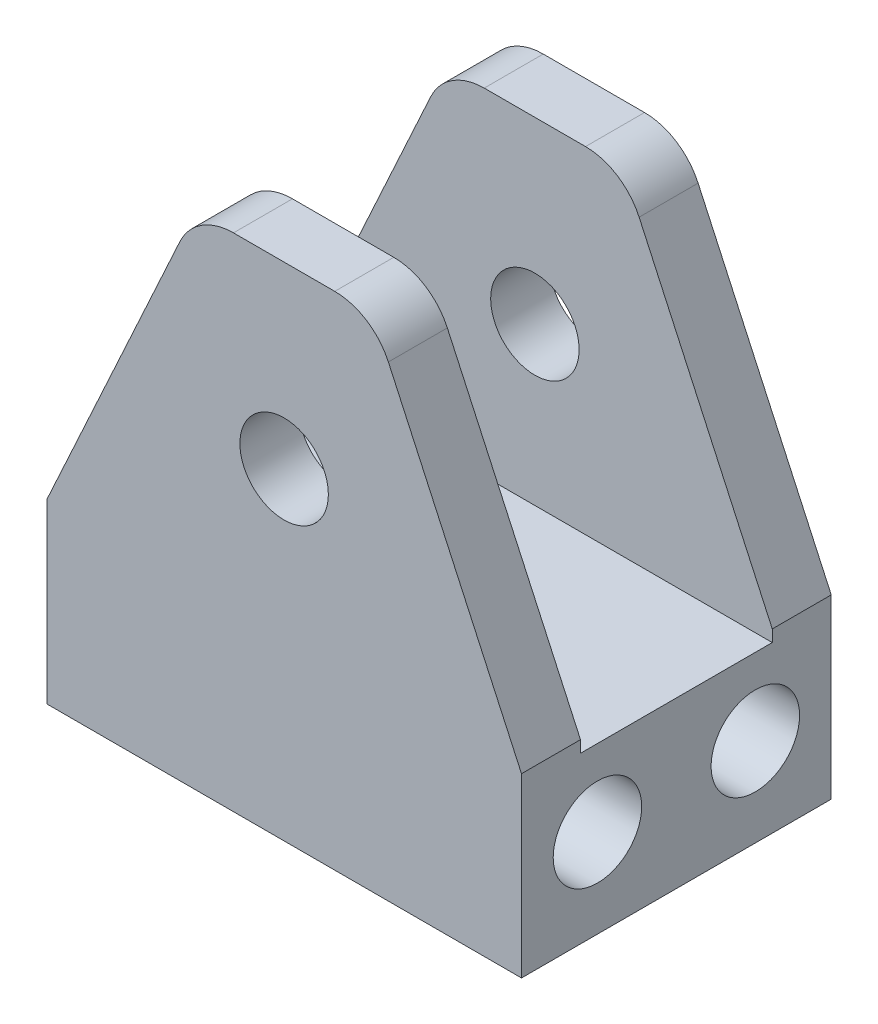
ISO-10303-21;
HEADER;
FILE_DESCRIPTION(('STEP AP214'),'2;1');
FILE_NAME('part.step','',(''),(''),'','','');
FILE_SCHEMA(('AUTOMOTIVE_DESIGN { 1 0 10303 214 1 1 1 1 }'));
ENDSEC;
DATA;
#1=APPLICATION_CONTEXT('core data for automotive mechanical design processes');
#2=APPLICATION_PROTOCOL_DEFINITION('international standard','automotive_design',2000,#1);
#3=PRODUCT_CONTEXT('',#1,'mechanical');
#4=PRODUCT('Part','Part','',(#3));
#5=PRODUCT_RELATED_PRODUCT_CATEGORY('part','',(#4));
#6=PRODUCT_DEFINITION_FORMATION('','',#4);
#7=PRODUCT_DEFINITION_CONTEXT('part definition',#1,'design');
#8=PRODUCT_DEFINITION('design','',#6,#7);
#9=PRODUCT_DEFINITION_SHAPE('','',#8);
#10=(LENGTH_UNIT() NAMED_UNIT(*) SI_UNIT(.MILLI.,.METRE.));
#11=(NAMED_UNIT(*) PLANE_ANGLE_UNIT() SI_UNIT($,.RADIAN.));
#12=(NAMED_UNIT(*) SI_UNIT($,.STERADIAN.) SOLID_ANGLE_UNIT());
#13=UNCERTAINTY_MEASURE_WITH_UNIT(LENGTH_MEASURE(1.E-05),#10,'distance_accuracy_value','');
#14=(GEOMETRIC_REPRESENTATION_CONTEXT(3) GLOBAL_UNCERTAINTY_ASSIGNED_CONTEXT((#13)) GLOBAL_UNIT_ASSIGNED_CONTEXT((#10,
#11,#12)) REPRESENTATION_CONTEXT('',''));
#15=CARTESIAN_POINT('',(0.,0.,0.));
#16=DIRECTION('',(0.,0.,1.));
#17=DIRECTION('',(1.,0.,0.));
#18=AXIS2_PLACEMENT_3D('',#15,#16,#17);
#19=CARTESIAN_POINT('',(0.,44.45,0.));
#20=DIRECTION('',(0.,-1.,0.));
#21=DIRECTION('',(0.,0.,-1.));
#22=AXIS2_PLACEMENT_3D('',#19,#20,#21);
#23=PLANE('',#22);
#24=DIRECTION('',(-1.,0.,0.));
#25=VECTOR('',#24,1.);
#26=CARTESIAN_POINT('',(-25.55875,44.45,-10.3251));
#27=LINE('',#26,#25);
#28=CARTESIAN_POINT('',(5.45302110347387,44.45,-10.3251));
#29=VERTEX_POINT('',#28);
#30=CARTESIAN_POINT('',(-5.45302110347386,44.45,-10.3251));
#31=VERTEX_POINT('',#30);
#32=EDGE_CURVE('E274',#29,#31,#27,.T.);
#33=ORIENTED_EDGE('',*,*,#32,.F.);
#34=DIRECTION('',(0.,0.,-1.));
#35=VECTOR('',#34,1.);
#36=CARTESIAN_POINT('',(5.45302110347387,44.45,0.));
#37=LINE('',#36,#35);
#38=CARTESIAN_POINT('',(5.45302110347386,44.45,-16.6751));
#39=VERTEX_POINT('',#38);
#40=EDGE_CURVE('E227',#29,#39,#37,.T.);
#41=ORIENTED_EDGE('',*,*,#40,.T.);
#42=DIRECTION('',(-1.,0.,0.));
#43=VECTOR('',#42,1.);
#44=CARTESIAN_POINT('',(-25.55875,44.45,-16.6751));
#45=LINE('',#44,#43);
#46=CARTESIAN_POINT('',(-5.45302110347387,44.45,-16.6751));
#47=VERTEX_POINT('',#46);
#48=EDGE_CURVE('E304',#39,#47,#45,.T.);
#49=ORIENTED_EDGE('',*,*,#48,.T.);
#50=DIRECTION('',(0.,0.,-1.));
#51=VECTOR('',#50,1.);
#52=CARTESIAN_POINT('',(-5.45302110347387,44.45,-10.3251));
#53=LINE('',#52,#51);
#54=EDGE_CURVE('E225',#47,#31,#53,.F.);
#55=ORIENTED_EDGE('',*,*,#54,.T.);
#56=EDGE_LOOP('',(#33,#41,#49,#55));
#57=FACE_BOUND('',#56,.T.);
#58=ADVANCED_FACE('F41',(#57),#23,.F.);
#59=CARTESIAN_POINT('',(-25.55875,-9.525,16.6751));
#60=DIRECTION('',(0.,0.,1.));
#61=DIRECTION('',(1.,0.,0.));
#62=AXIS2_PLACEMENT_3D('',#59,#60,#61);
#63=PLANE('',#62);
#64=CARTESIAN_POINT('',(-2.32470293015652E-11,25.1616625766068,16.6751));
#65=DIRECTION('',(0.,0.,1.));
#66=DIRECTION('',(1.,0.,0.));
#67=AXIS2_PLACEMENT_3D('',#64,#65,#66);
#68=CIRCLE('',#67,4.76249999999999);
#69=CARTESIAN_POINT('',(4.76249999997674,25.1616625766068,16.6751));
#70=VERTEX_POINT('',#69);
#71=EDGE_CURVE('E239',#70,#70,#68,.T.);
#72=ORIENTED_EDGE('',*,*,#71,.F.);
#73=EDGE_LOOP('',(#72));
#74=FACE_BOUND('',#73,.T.);
#75=DIRECTION('',(-0.417223594396781,0.908803868983088,0.));
#76=VECTOR('',#75,1.);
#77=CARTESIAN_POINT('',(24.7212334260508,11.3492935274142,16.6751));
#78=LINE('',#77,#76);
#79=CARTESIAN_POINT('',(25.55875,9.52499999999999,16.6751));
#80=VERTEX_POINT('',#79);
#81=CARTESIAN_POINT('',(11.2239256715165,40.7493698244196,16.6751));
#82=VERTEX_POINT('',#81);
#83=EDGE_CURVE('E256',#80,#82,#78,.T.);
#84=ORIENTED_EDGE('',*,*,#83,.T.);
#85=CARTESIAN_POINT('',(5.45302110347387,38.1,16.6751));
#86=DIRECTION('',(0.,0.,1.));
#87=DIRECTION('',(1.,0.,0.));
#88=AXIS2_PLACEMENT_3D('',#85,#86,#87);
#89=CIRCLE('',#88,6.35);
#90=CARTESIAN_POINT('',(5.45302110347386,44.45,16.6751));
#91=VERTEX_POINT('',#90);
#92=EDGE_CURVE('E221',#82,#91,#89,.T.);
#93=ORIENTED_EDGE('',*,*,#92,.T.);
#94=DIRECTION('',(1.,0.,0.));
#95=VECTOR('',#94,1.);
#96=CARTESIAN_POINT('',(-25.55875,44.45,16.6751));
#97=LINE('',#96,#95);
#98=CARTESIAN_POINT('',(-5.45302110347387,44.45,16.6751));
#99=VERTEX_POINT('',#98);
#100=EDGE_CURVE('E307',#99,#91,#97,.T.);
#101=ORIENTED_EDGE('',*,*,#100,.F.);
#102=CARTESIAN_POINT('',(-5.45302110347387,38.1,16.6751));
#103=DIRECTION('',(0.,0.,1.));
#104=DIRECTION('',(1.,0.,0.));
#105=AXIS2_PLACEMENT_3D('',#102,#103,#104);
#106=CIRCLE('',#105,6.35);
#107=CARTESIAN_POINT('',(-11.2239256715165,40.7493698244196,16.6751));
#108=VERTEX_POINT('',#107);
#109=EDGE_CURVE('E182',#99,#108,#106,.T.);
#110=ORIENTED_EDGE('',*,*,#109,.T.);
#111=DIRECTION('',(0.417223594396782,0.908803868983088,0.));
#112=VECTOR('',#111,1.);
#113=CARTESIAN_POINT('',(-24.7212334260508,11.3492935274142,16.6751));
#114=LINE('',#113,#112);
#115=CARTESIAN_POINT('',(-25.55875,9.525,16.6751));
#116=VERTEX_POINT('',#115);
#117=EDGE_CURVE('E163',#116,#108,#114,.T.);
#118=ORIENTED_EDGE('',*,*,#117,.F.);
#119=DIRECTION('',(0.,1.,0.));
#120=VECTOR('',#119,1.);
#121=CARTESIAN_POINT('',(-25.55875,-9.525,16.6751));
#122=LINE('',#121,#120);
#123=CARTESIAN_POINT('',(-25.55875,-9.525,16.6751));
#124=VERTEX_POINT('',#123);
#125=EDGE_CURVE('E178',#124,#116,#122,.T.);
#126=ORIENTED_EDGE('',*,*,#125,.F.);
#127=DIRECTION('',(1.,0.,0.));
#128=VECTOR('',#127,1.);
#129=CARTESIAN_POINT('',(-25.55875,-9.525,16.6751));
#130=LINE('',#129,#128);
#131=CARTESIAN_POINT('',(25.55875,-9.525,16.6751));
#132=VERTEX_POINT('',#131);
#133=EDGE_CURVE('E208',#124,#132,#130,.T.);
#134=ORIENTED_EDGE('',*,*,#133,.T.);
#135=DIRECTION('',(0.,1.,0.));
#136=VECTOR('',#135,1.);
#137=CARTESIAN_POINT('',(25.55875,-9.525,16.6751));
#138=LINE('',#137,#136);
#139=EDGE_CURVE('E189',#132,#80,#138,.T.);
#140=ORIENTED_EDGE('',*,*,#139,.T.);
#141=EDGE_LOOP('',(#84,#93,#101,#110,#118,#126,#134,#140));
#142=FACE_BOUND('',#141,.T.);
#143=ADVANCED_FACE('F176',(#74,#142),#63,.T.);
#144=CARTESIAN_POINT('',(-25.55875,-9.525,16.6751));
#145=DIRECTION('',(-1.,0.,0.));
#146=DIRECTION('',(0.,0.,1.));
#147=AXIS2_PLACEMENT_3D('',#144,#145,#146);
#148=PLANE('',#147);
#149=CARTESIAN_POINT('',(-25.55875,0.,-8.5));
#150=DIRECTION('',(-1.,0.,0.));
#151=DIRECTION('',(0.,0.,1.));
#152=AXIS2_PLACEMENT_3D('',#149,#150,#151);
#153=CIRCLE('',#152,4.76249999999999);
#154=CARTESIAN_POINT('',(-25.55875,0.,-3.73750000000001));
#155=VERTEX_POINT('',#154);
#156=EDGE_CURVE('E422',#155,#155,#153,.T.);
#157=ORIENTED_EDGE('',*,*,#156,.F.);
#158=EDGE_LOOP('',(#157));
#159=FACE_BOUND('',#158,.T.);
#160=CARTESIAN_POINT('',(-25.55875,0.,8.5));
#161=DIRECTION('',(-1.,0.,0.));
#162=DIRECTION('',(0.,0.,1.));
#163=AXIS2_PLACEMENT_3D('',#160,#161,#162);
#164=CIRCLE('',#163,4.76249999999999);
#165=CARTESIAN_POINT('',(-25.55875,0.,13.2625));
#166=VERTEX_POINT('',#165);
#167=EDGE_CURVE('E251',#166,#166,#164,.T.);
#168=ORIENTED_EDGE('',*,*,#167,.F.);
#169=EDGE_LOOP('',(#168));
#170=FACE_BOUND('',#169,.T.);
#171=ORIENTED_EDGE('',*,*,#125,.T.);
#172=DIRECTION('',(0.,0.,-1.));
#173=VECTOR('',#172,1.);
#174=CARTESIAN_POINT('',(-25.55875,9.525,16.6751));
#175=LINE('',#174,#173);
#176=CARTESIAN_POINT('',(-25.55875,9.525,10.3251));
#177=VERTEX_POINT('',#176);
#178=EDGE_CURVE('E159',#116,#177,#175,.T.);
#179=ORIENTED_EDGE('',*,*,#178,.T.);
#180=DIRECTION('',(0.,1.,0.));
#181=VECTOR('',#180,1.);
#182=CARTESIAN_POINT('',(-25.55875,-64.6560218143106,10.3251));
#183=LINE('',#182,#181);
#184=CARTESIAN_POINT('',(-25.55875,8.255,10.3251));
#185=VERTEX_POINT('',#184);
#186=EDGE_CURVE('E293',#185,#177,#183,.T.);
#187=ORIENTED_EDGE('',*,*,#186,.F.);
#188=DIRECTION('',(0.,0.,1.));
#189=VECTOR('',#188,1.);
#190=CARTESIAN_POINT('',(-25.55875,8.255,10.3251));
#191=LINE('',#190,#189);
#192=CARTESIAN_POINT('',(-25.55875,8.255,-10.3251));
#193=VERTEX_POINT('',#192);
#194=EDGE_CURVE('E294',#193,#185,#191,.T.);
#195=ORIENTED_EDGE('',*,*,#194,.F.);
#196=DIRECTION('',(0.,1.,0.));
#197=VECTOR('',#196,1.);
#198=CARTESIAN_POINT('',(-25.55875,-64.6560218143106,-10.3251));
#199=LINE('',#198,#197);
#200=CARTESIAN_POINT('',(-25.55875,9.52500000000001,-10.3251));
#201=VERTEX_POINT('',#200);
#202=EDGE_CURVE('E284',#193,#201,#199,.T.);
#203=ORIENTED_EDGE('',*,*,#202,.T.);
#204=CARTESIAN_POINT('',(-25.55875,9.525,-16.6751));
#205=VERTEX_POINT('',#204);
#206=EDGE_CURVE('E172',#201,#205,#175,.T.);
#207=ORIENTED_EDGE('',*,*,#206,.T.);
#208=DIRECTION('',(0.,1.,0.));
#209=VECTOR('',#208,1.);
#210=CARTESIAN_POINT('',(-25.55875,-9.525,-16.6751));
#211=LINE('',#210,#209);
#212=CARTESIAN_POINT('',(-25.55875,-9.525,-16.6751));
#213=VERTEX_POINT('',#212);
#214=EDGE_CURVE('E190',#213,#205,#211,.T.);
#215=ORIENTED_EDGE('',*,*,#214,.F.);
#216=DIRECTION('',(0.,0.,1.));
#217=VECTOR('',#216,1.);
#218=CARTESIAN_POINT('',(-25.55875,-9.525,16.6751));
#219=LINE('',#218,#217);
#220=EDGE_CURVE('E187',#213,#124,#219,.T.);
#221=ORIENTED_EDGE('',*,*,#220,.T.);
#222=EDGE_LOOP('',(#171,#179,#187,#195,#203,#207,#215,#221));
#223=FACE_BOUND('',#222,.T.);
#224=ADVANCED_FACE('F185',(#159,#170,#223),#148,.T.);
#225=CARTESIAN_POINT('',(-25.55875,-9.525,-16.6751));
#226=DIRECTION('',(0.,0.,-1.));
#227=DIRECTION('',(-1.,0.,0.));
#228=AXIS2_PLACEMENT_3D('',#225,#226,#227);
#229=PLANE('',#228);
#230=CARTESIAN_POINT('',(-2.32470293015652E-11,25.1616625766068,-16.6751));
#231=DIRECTION('',(0.,0.,-1.));
#232=DIRECTION('',(-1.,0.,0.));
#233=AXIS2_PLACEMENT_3D('',#230,#231,#232);
#234=CIRCLE('',#233,4.76249999999999);
#235=CARTESIAN_POINT('',(-4.76250000002324,25.1616625766068,-16.6751));
#236=VERTEX_POINT('',#235);
#237=EDGE_CURVE('E236',#236,#236,#234,.T.);
#238=ORIENTED_EDGE('',*,*,#237,.F.);
#239=EDGE_LOOP('',(#238));
#240=FACE_BOUND('',#239,.T.);
#241=ORIENTED_EDGE('',*,*,#48,.F.);
#242=CARTESIAN_POINT('',(5.45302110347387,38.1,-16.6751));
#243=DIRECTION('',(0.,0.,-1.));
#244=DIRECTION('',(-1.,0.,0.));
#245=AXIS2_PLACEMENT_3D('',#242,#243,#244);
#246=CIRCLE('',#245,6.35);
#247=CARTESIAN_POINT('',(11.2239256715165,40.7493698244196,-16.6751));
#248=VERTEX_POINT('',#247);
#249=EDGE_CURVE('E232',#39,#248,#246,.T.);
#250=ORIENTED_EDGE('',*,*,#249,.T.);
#251=DIRECTION('',(-0.417223594396782,0.908803868983088,0.));
#252=VECTOR('',#251,1.);
#253=CARTESIAN_POINT('',(23.8837168521015,13.1735870548284,-16.6751));
#254=LINE('',#253,#252);
#255=CARTESIAN_POINT('',(25.55875,9.52499999999999,-16.6751));
#256=VERTEX_POINT('',#255);
#257=EDGE_CURVE('E271',#256,#248,#254,.T.);
#258=ORIENTED_EDGE('',*,*,#257,.F.);
#259=DIRECTION('',(0.,1.,0.));
#260=VECTOR('',#259,1.);
#261=CARTESIAN_POINT('',(25.55875,-9.525,-16.6751));
#262=LINE('',#261,#260);
#263=CARTESIAN_POINT('',(25.55875,-9.525,-16.6751));
#264=VERTEX_POINT('',#263);
#265=EDGE_CURVE('E196',#264,#256,#262,.T.);
#266=ORIENTED_EDGE('',*,*,#265,.F.);
#267=DIRECTION('',(-1.,0.,0.));
#268=VECTOR('',#267,1.);
#269=CARTESIAN_POINT('',(-25.55875,-9.525,-16.6751));
#270=LINE('',#269,#268);
#271=EDGE_CURVE('E313',#264,#213,#270,.T.);
#272=ORIENTED_EDGE('',*,*,#271,.T.);
#273=ORIENTED_EDGE('',*,*,#214,.T.);
#274=DIRECTION('',(0.417223594396782,0.908803868983088,0.));
#275=VECTOR('',#274,1.);
#276=CARTESIAN_POINT('',(-32.7820226403986,-6.2088611969079,-16.6751));
#277=LINE('',#276,#275);
#278=CARTESIAN_POINT('',(-11.2239256715165,40.7493698244196,-16.6751));
#279=VERTEX_POINT('',#278);
#280=EDGE_CURVE('E270',#205,#279,#277,.T.);
#281=ORIENTED_EDGE('',*,*,#280,.T.);
#282=CARTESIAN_POINT('',(-5.45302110347387,38.1,-16.6751));
#283=DIRECTION('',(0.,0.,-1.));
#284=DIRECTION('',(-1.,0.,0.));
#285=AXIS2_PLACEMENT_3D('',#282,#283,#284);
#286=CIRCLE('',#285,6.35);
#287=EDGE_CURVE('E230',#279,#47,#286,.T.);
#288=ORIENTED_EDGE('',*,*,#287,.T.);
#289=EDGE_LOOP('',(#241,#250,#258,#266,#272,#273,#281,#288));
#290=FACE_BOUND('',#289,.T.);
#291=ADVANCED_FACE('F350',(#240,#290),#229,.T.);
#292=ORIENTED_EDGE('',*,*,#100,.T.);
#293=DIRECTION('',(0.,0.,-1.));
#294=VECTOR('',#293,1.);
#295=CARTESIAN_POINT('',(5.45302110347387,44.45,0.));
#296=LINE('',#295,#294);
#297=CARTESIAN_POINT('',(5.45302110347387,44.45,10.3251));
#298=VERTEX_POINT('',#297);
#299=EDGE_CURVE('E211',#91,#298,#296,.T.);
#300=ORIENTED_EDGE('',*,*,#299,.T.);
#301=DIRECTION('',(1.,0.,0.));
#302=VECTOR('',#301,1.);
#303=CARTESIAN_POINT('',(-25.55875,44.45,10.3251));
#304=LINE('',#303,#302);
#305=CARTESIAN_POINT('',(-5.45302110347386,44.45,10.3251));
#306=VERTEX_POINT('',#305);
#307=EDGE_CURVE('E277',#306,#298,#304,.T.);
#308=ORIENTED_EDGE('',*,*,#307,.F.);
#309=DIRECTION('',(0.,0.,-1.));
#310=VECTOR('',#309,1.);
#311=CARTESIAN_POINT('',(-5.45302110347387,44.45,16.6751));
#312=LINE('',#311,#310);
#313=EDGE_CURVE('E209',#306,#99,#312,.F.);
#314=ORIENTED_EDGE('',*,*,#313,.T.);
#315=EDGE_LOOP('',(#292,#300,#308,#314));
#316=FACE_BOUND('',#315,.T.);
#317=ADVANCED_FACE('F364',(#316),#23,.F.);
#318=CARTESIAN_POINT('',(-25.55875,-64.6560218143106,-10.3251));
#319=DIRECTION('',(0.,0.,-1.));
#320=DIRECTION('',(-1.,0.,0.));
#321=AXIS2_PLACEMENT_3D('',#318,#319,#320);
#322=PLANE('',#321);
#323=CARTESIAN_POINT('',(-2.32470293015652E-11,25.1616625766068,-10.3251));
#324=DIRECTION('',(0.,0.,-1.));
#325=DIRECTION('',(-1.,0.,0.));
#326=AXIS2_PLACEMENT_3D('',#323,#324,#325);
#327=CIRCLE('',#326,4.76249999999999);
#328=CARTESIAN_POINT('',(-4.76250000002324,25.1616625766068,-10.3251));
#329=VERTEX_POINT('',#328);
#330=EDGE_CURVE('E238',#329,#329,#327,.T.);
#331=ORIENTED_EDGE('',*,*,#330,.T.);
#332=EDGE_LOOP('',(#331));
#333=FACE_BOUND('',#332,.T.);
#334=DIRECTION('',(-0.417223594396782,0.908803868983088,0.));
#335=VECTOR('',#334,1.);
#336=CARTESIAN_POINT('',(44.7879898971687,-32.3604730433377,-10.3251));
#337=LINE('',#336,#335);
#338=CARTESIAN_POINT('',(25.55875,9.525,-10.3251));
#339=VERTEX_POINT('',#338);
#340=CARTESIAN_POINT('',(11.2239256715165,40.7493698244196,-10.3251));
#341=VERTEX_POINT('',#340);
#342=EDGE_CURVE('E171',#339,#341,#337,.T.);
#343=ORIENTED_EDGE('',*,*,#342,.T.);
#344=CARTESIAN_POINT('',(5.45302110347387,38.1,-10.3251));
#345=DIRECTION('',(0.,0.,-1.));
#346=DIRECTION('',(-1.,0.,0.));
#347=AXIS2_PLACEMENT_3D('',#344,#345,#346);
#348=CIRCLE('',#347,6.35);
#349=EDGE_CURVE('E50',#341,#29,#348,.F.);
#350=ORIENTED_EDGE('',*,*,#349,.T.);
#351=ORIENTED_EDGE('',*,*,#32,.T.);
#352=CARTESIAN_POINT('',(-5.45302110347387,38.1,-10.3251));
#353=DIRECTION('',(0.,0.,-1.));
#354=DIRECTION('',(-1.,0.,0.));
#355=AXIS2_PLACEMENT_3D('',#352,#353,#354);
#356=CIRCLE('',#355,6.35);
#357=CARTESIAN_POINT('',(-11.2239256715165,40.7493698244196,-10.3251));
#358=VERTEX_POINT('',#357);
#359=EDGE_CURVE('E58',#31,#358,#356,.F.);
#360=ORIENTED_EDGE('',*,*,#359,.T.);
#361=DIRECTION('',(0.417223594396782,0.908803868983088,0.));
#362=VECTOR('',#361,1.);
#363=CARTESIAN_POINT('',(-53.6862956854658,-51.7429212950741,-10.3251));
#364=LINE('',#363,#362);
#365=EDGE_CURVE('E268',#201,#358,#364,.T.);
#366=ORIENTED_EDGE('',*,*,#365,.F.);
#367=ORIENTED_EDGE('',*,*,#202,.F.);
#368=DIRECTION('',(-1.,0.,0.));
#369=VECTOR('',#368,1.);
#370=CARTESIAN_POINT('',(-25.55875,8.255,-10.3251));
#371=LINE('',#370,#369);
#372=CARTESIAN_POINT('',(25.55875,8.255,-10.3251));
#373=VERTEX_POINT('',#372);
#374=EDGE_CURVE('E280',#373,#193,#371,.T.);
#375=ORIENTED_EDGE('',*,*,#374,.F.);
#376=DIRECTION('',(0.,1.,0.));
#377=VECTOR('',#376,1.);
#378=CARTESIAN_POINT('',(25.55875,-64.6560218143106,-10.3251));
#379=LINE('',#378,#377);
#380=EDGE_CURVE('E288',#373,#339,#379,.T.);
#381=ORIENTED_EDGE('',*,*,#380,.T.);
#382=EDGE_LOOP('',(#343,#350,#351,#360,#366,#367,#375,#381));
#383=FACE_BOUND('',#382,.T.);
#384=ADVANCED_FACE('F342',(#333,#383),#322,.F.);
#385=CARTESIAN_POINT('',(-25.55875,-64.6560218143106,10.3251));
#386=DIRECTION('',(0.,0.,1.));
#387=DIRECTION('',(1.,0.,0.));
#388=AXIS2_PLACEMENT_3D('',#385,#386,#387);
#389=PLANE('',#388);
#390=CARTESIAN_POINT('',(-2.32470293015652E-11,25.1616625766068,10.3251));
#391=DIRECTION('',(0.,0.,1.));
#392=DIRECTION('',(1.,0.,0.));
#393=AXIS2_PLACEMENT_3D('',#390,#391,#392);
#394=CIRCLE('',#393,4.76249999999999);
#395=CARTESIAN_POINT('',(4.76249999997674,25.1616625766068,10.3251));
#396=VERTEX_POINT('',#395);
#397=EDGE_CURVE('E243',#396,#396,#394,.T.);
#398=ORIENTED_EDGE('',*,*,#397,.T.);
#399=EDGE_LOOP('',(#398));
#400=FACE_BOUND('',#399,.T.);
#401=ORIENTED_EDGE('',*,*,#307,.T.);
#402=CARTESIAN_POINT('',(5.45302110347387,38.1,10.3251));
#403=DIRECTION('',(0.,0.,1.));
#404=DIRECTION('',(1.,0.,0.));
#405=AXIS2_PLACEMENT_3D('',#402,#403,#404);
#406=CIRCLE('',#405,6.35);
#407=CARTESIAN_POINT('',(11.2239256715165,40.7493698244196,10.3251));
#408=VERTEX_POINT('',#407);
#409=EDGE_CURVE('E216',#298,#408,#406,.F.);
#410=ORIENTED_EDGE('',*,*,#409,.T.);
#411=DIRECTION('',(0.417223594396782,-0.908803868983088,0.));
#412=VECTOR('',#411,1.);
#413=CARTESIAN_POINT('',(44.7879898971687,-32.3604730433377,10.3251));
#414=LINE('',#413,#412);
#415=CARTESIAN_POINT('',(25.55875,9.52499999999998,10.3251));
#416=VERTEX_POINT('',#415);
#417=EDGE_CURVE('E193',#408,#416,#414,.T.);
#418=ORIENTED_EDGE('',*,*,#417,.T.);
#419=DIRECTION('',(0.,1.,0.));
#420=VECTOR('',#419,1.);
#421=CARTESIAN_POINT('',(25.55875,-64.6560218143106,10.3251));
#422=LINE('',#421,#420);
#423=CARTESIAN_POINT('',(25.55875,8.255,10.3251));
#424=VERTEX_POINT('',#423);
#425=EDGE_CURVE('E289',#424,#416,#422,.T.);
#426=ORIENTED_EDGE('',*,*,#425,.F.);
#427=DIRECTION('',(1.,0.,0.));
#428=VECTOR('',#427,1.);
#429=CARTESIAN_POINT('',(-25.55875,8.255,10.3251));
#430=LINE('',#429,#428);
#431=EDGE_CURVE('E290',#185,#424,#430,.T.);
#432=ORIENTED_EDGE('',*,*,#431,.F.);
#433=ORIENTED_EDGE('',*,*,#186,.T.);
#434=DIRECTION('',(-0.417223594396782,-0.908803868983088,0.));
#435=VECTOR('',#434,1.);
#436=CARTESIAN_POINT('',(-53.6862956854658,-51.7429212950741,10.3251));
#437=LINE('',#436,#435);
#438=CARTESIAN_POINT('',(-11.2239256715165,40.7493698244196,10.3251));
#439=VERTEX_POINT('',#438);
#440=EDGE_CURVE('E166',#439,#177,#437,.T.);
#441=ORIENTED_EDGE('',*,*,#440,.F.);
#442=CARTESIAN_POINT('',(-5.45302110347387,38.1,10.3251));
#443=DIRECTION('',(0.,0.,1.));
#444=DIRECTION('',(1.,0.,0.));
#445=AXIS2_PLACEMENT_3D('',#442,#443,#444);
#446=CIRCLE('',#445,6.35);
#447=EDGE_CURVE('E214',#439,#306,#446,.F.);
#448=ORIENTED_EDGE('',*,*,#447,.T.);
#449=EDGE_LOOP('',(#401,#410,#418,#426,#432,#433,#441,#448));
#450=FACE_BOUND('',#449,.T.);
#451=ADVANCED_FACE('F356',(#400,#450),#389,.F.);
#452=CARTESIAN_POINT('',(25.55875,-9.525,16.6751));
#453=DIRECTION('',(1.,0.,0.));
#454=DIRECTION('',(0.,0.,-1.));
#455=AXIS2_PLACEMENT_3D('',#452,#453,#454);
#456=PLANE('',#455);
#457=CARTESIAN_POINT('',(25.55875,0.,-8.5));
#458=DIRECTION('',(1.,0.,0.));
#459=DIRECTION('',(0.,0.,-1.));
#460=AXIS2_PLACEMENT_3D('',#457,#458,#459);
#461=CIRCLE('',#460,4.76249999999999);
#462=CARTESIAN_POINT('',(25.55875,0.,-13.2625));
#463=VERTEX_POINT('',#462);
#464=EDGE_CURVE('E45',#463,#463,#461,.T.);
#465=ORIENTED_EDGE('',*,*,#464,.F.);
#466=EDGE_LOOP('',(#465));
#467=FACE_BOUND('',#466,.T.);
#468=CARTESIAN_POINT('',(25.55875,0.,8.5));
#469=DIRECTION('',(1.,0.,0.));
#470=DIRECTION('',(0.,0.,-1.));
#471=AXIS2_PLACEMENT_3D('',#468,#469,#470);
#472=CIRCLE('',#471,4.76249999999999);
#473=CARTESIAN_POINT('',(25.55875,0.,3.73750000000001));
#474=VERTEX_POINT('',#473);
#475=EDGE_CURVE('E246',#474,#474,#472,.T.);
#476=ORIENTED_EDGE('',*,*,#475,.F.);
#477=EDGE_LOOP('',(#476));
#478=FACE_BOUND('',#477,.T.);
#479=DIRECTION('',(0.,0.,-1.));
#480=VECTOR('',#479,1.);
#481=CARTESIAN_POINT('',(25.55875,9.52499999999999,16.6751));
#482=LINE('',#481,#480);
#483=EDGE_CURVE('E183',#80,#416,#482,.T.);
#484=ORIENTED_EDGE('',*,*,#483,.F.);
#485=ORIENTED_EDGE('',*,*,#139,.F.);
#486=DIRECTION('',(0.,0.,-1.));
#487=VECTOR('',#486,1.);
#488=CARTESIAN_POINT('',(25.55875,-9.525,16.6751));
#489=LINE('',#488,#487);
#490=EDGE_CURVE('E310',#132,#264,#489,.T.);
#491=ORIENTED_EDGE('',*,*,#490,.T.);
#492=ORIENTED_EDGE('',*,*,#265,.T.);
#493=EDGE_CURVE('E328',#339,#256,#482,.T.);
#494=ORIENTED_EDGE('',*,*,#493,.F.);
#495=ORIENTED_EDGE('',*,*,#380,.F.);
#496=DIRECTION('',(0.,0.,-1.));
#497=VECTOR('',#496,1.);
#498=CARTESIAN_POINT('',(25.55875,8.255,10.3251));
#499=LINE('',#498,#497);
#500=EDGE_CURVE('E285',#424,#373,#499,.T.);
#501=ORIENTED_EDGE('',*,*,#500,.F.);
#502=ORIENTED_EDGE('',*,*,#425,.T.);
#503=EDGE_LOOP('',(#484,#485,#491,#492,#494,#495,#501,#502));
#504=FACE_BOUND('',#503,.T.);
#505=ADVANCED_FACE('F322',(#467,#478,#504),#456,.T.);
#506=CARTESIAN_POINT('',(0.,-9.525,0.));
#507=DIRECTION('',(0.,-1.,0.));
#508=DIRECTION('',(0.,0.,-1.));
#509=AXIS2_PLACEMENT_3D('',#506,#507,#508);
#510=PLANE('',#509);
#511=ORIENTED_EDGE('',*,*,#490,.F.);
#512=ORIENTED_EDGE('',*,*,#133,.F.);
#513=ORIENTED_EDGE('',*,*,#220,.F.);
#514=ORIENTED_EDGE('',*,*,#271,.F.);
#515=EDGE_LOOP('',(#511,#512,#513,#514));
#516=FACE_BOUND('',#515,.T.);
#517=ADVANCED_FACE('F318',(#516),#510,.T.);
#518=CARTESIAN_POINT('',(0.,8.255,0.));
#519=DIRECTION('',(0.,-1.,0.));
#520=DIRECTION('',(0.,0.,-1.));
#521=AXIS2_PLACEMENT_3D('',#518,#519,#520);
#522=PLANE('',#521);
#523=ORIENTED_EDGE('',*,*,#500,.T.);
#524=ORIENTED_EDGE('',*,*,#374,.T.);
#525=ORIENTED_EDGE('',*,*,#194,.T.);
#526=ORIENTED_EDGE('',*,*,#431,.T.);
#527=EDGE_LOOP('',(#523,#524,#525,#526));
#528=FACE_BOUND('',#527,.T.);
#529=ADVANCED_FACE('F353',(#528),#522,.F.);
#530=CARTESIAN_POINT('',(24.7212334260508,11.3492935274142,16.6751));
#531=DIRECTION('',(-0.908803868983088,-0.417223594396781,0.));
#532=DIRECTION('',(0.417223594396782,-0.908803868983088,0.));
#533=AXIS2_PLACEMENT_3D('',#530,#531,#532);
#534=PLANE('',#533);
#535=ORIENTED_EDGE('',*,*,#417,.F.);
#536=DIRECTION('',(0.,0.,-1.));
#537=VECTOR('',#536,1.);
#538=CARTESIAN_POINT('',(11.2239256715165,40.7493698244196,16.6751));
#539=LINE('',#538,#537);
#540=EDGE_CURVE('E218',#408,#82,#539,.F.);
#541=ORIENTED_EDGE('',*,*,#540,.T.);
#542=ORIENTED_EDGE('',*,*,#83,.F.);
#543=ORIENTED_EDGE('',*,*,#483,.T.);
#544=EDGE_LOOP('',(#535,#541,#542,#543));
#545=FACE_BOUND('',#544,.T.);
#546=ADVANCED_FACE('F358',(#545),#534,.F.);
#547=CARTESIAN_POINT('',(-24.7212334260508,11.3492935274142,16.6751));
#548=DIRECTION('',(-0.908803868983088,0.417223594396782,0.));
#549=DIRECTION('',(-0.417223594396782,-0.908803868983088,0.));
#550=AXIS2_PLACEMENT_3D('',#547,#548,#549);
#551=PLANE('',#550);
#552=ORIENTED_EDGE('',*,*,#117,.T.);
#553=DIRECTION('',(0.,0.,-1.));
#554=VECTOR('',#553,1.);
#555=CARTESIAN_POINT('',(-11.2239256715165,40.7493698244196,10.3251));
#556=LINE('',#555,#554);
#557=EDGE_CURVE('E223',#108,#439,#556,.T.);
#558=ORIENTED_EDGE('',*,*,#557,.T.);
#559=ORIENTED_EDGE('',*,*,#440,.T.);
#560=ORIENTED_EDGE('',*,*,#178,.F.);
#561=EDGE_LOOP('',(#552,#558,#559,#560));
#562=FACE_BOUND('',#561,.T.);
#563=ADVANCED_FACE('F161',(#562),#551,.T.);
#564=ORIENTED_EDGE('',*,*,#257,.T.);
#565=DIRECTION('',(0.,0.,-1.));
#566=VECTOR('',#565,1.);
#567=CARTESIAN_POINT('',(11.2239256715165,40.7493698244196,16.6751));
#568=LINE('',#567,#566);
#569=EDGE_CURVE('E66',#248,#341,#568,.F.);
#570=ORIENTED_EDGE('',*,*,#569,.T.);
#571=ORIENTED_EDGE('',*,*,#342,.F.);
#572=ORIENTED_EDGE('',*,*,#493,.T.);
#573=EDGE_LOOP('',(#564,#570,#571,#572));
#574=FACE_BOUND('',#573,.T.);
#575=ADVANCED_FACE('F335',(#574),#534,.F.);
#576=ORIENTED_EDGE('',*,*,#365,.T.);
#577=DIRECTION('',(0.,0.,-1.));
#578=VECTOR('',#577,1.);
#579=CARTESIAN_POINT('',(-11.2239256715165,40.7493698244196,-16.6751));
#580=LINE('',#579,#578);
#581=EDGE_CURVE('E12',#358,#279,#580,.T.);
#582=ORIENTED_EDGE('',*,*,#581,.T.);
#583=ORIENTED_EDGE('',*,*,#280,.F.);
#584=ORIENTED_EDGE('',*,*,#206,.F.);
#585=EDGE_LOOP('',(#576,#582,#583,#584));
#586=FACE_BOUND('',#585,.T.);
#587=ADVANCED_FACE('F349',(#586),#551,.T.);
#588=CARTESIAN_POINT('',(5.45302110347387,38.1,0.));
#589=DIRECTION('',(0.,0.,-1.));
#590=DIRECTION('',(-1.,0.,0.));
#591=AXIS2_PLACEMENT_3D('',#588,#589,#590);
#592=CYLINDRICAL_SURFACE('',#591,6.35);
#593=ORIENTED_EDGE('',*,*,#92,.F.);
#594=ORIENTED_EDGE('',*,*,#540,.F.);
#595=ORIENTED_EDGE('',*,*,#409,.F.);
#596=ORIENTED_EDGE('',*,*,#299,.F.);
#597=EDGE_LOOP('',(#593,#594,#595,#596));
#598=FACE_BOUND('',#597,.T.);
#599=ADVANCED_FACE('F361',(#598),#592,.T.);
#600=CARTESIAN_POINT('',(-5.45302110347387,38.1,16.6751));
#601=DIRECTION('',(0.,0.,1.));
#602=DIRECTION('',(1.,0.,0.));
#603=AXIS2_PLACEMENT_3D('',#600,#601,#602);
#604=CYLINDRICAL_SURFACE('',#603,6.35);
#605=ORIENTED_EDGE('',*,*,#109,.F.);
#606=ORIENTED_EDGE('',*,*,#313,.F.);
#607=ORIENTED_EDGE('',*,*,#447,.F.);
#608=ORIENTED_EDGE('',*,*,#557,.F.);
#609=EDGE_LOOP('',(#605,#606,#607,#608));
#610=FACE_BOUND('',#609,.T.);
#611=ADVANCED_FACE('F368',(#610),#604,.T.);
#612=CARTESIAN_POINT('',(5.45302110347387,38.1,0.));
#613=DIRECTION('',(0.,0.,-1.));
#614=DIRECTION('',(-1.,0.,0.));
#615=AXIS2_PLACEMENT_3D('',#612,#613,#614);
#616=CYLINDRICAL_SURFACE('',#615,6.35);
#617=ORIENTED_EDGE('',*,*,#349,.F.);
#618=ORIENTED_EDGE('',*,*,#569,.F.);
#619=ORIENTED_EDGE('',*,*,#249,.F.);
#620=ORIENTED_EDGE('',*,*,#40,.F.);
#621=EDGE_LOOP('',(#617,#618,#619,#620));
#622=FACE_BOUND('',#621,.T.);
#623=ADVANCED_FACE('F339',(#622),#616,.T.);
#624=CARTESIAN_POINT('',(-5.45302110347387,38.1,16.6751));
#625=DIRECTION('',(0.,0.,1.));
#626=DIRECTION('',(1.,0.,0.));
#627=AXIS2_PLACEMENT_3D('',#624,#625,#626);
#628=CYLINDRICAL_SURFACE('',#627,6.35);
#629=ORIENTED_EDGE('',*,*,#359,.F.);
#630=ORIENTED_EDGE('',*,*,#54,.F.);
#631=ORIENTED_EDGE('',*,*,#287,.F.);
#632=ORIENTED_EDGE('',*,*,#581,.F.);
#633=EDGE_LOOP('',(#629,#630,#631,#632));
#634=FACE_BOUND('',#633,.T.);
#635=ADVANCED_FACE('F43',(#634),#628,.T.);
#636=CARTESIAN_POINT('',(-2.32470293015652E-11,25.1616625766068,16.6751));
#637=DIRECTION('',(0.,0.,1.));
#638=DIRECTION('',(1.,0.,0.));
#639=AXIS2_PLACEMENT_3D('',#636,#637,#638);
#640=CYLINDRICAL_SURFACE('',#639,4.76249999999999);
#641=ORIENTED_EDGE('',*,*,#237,.T.);
#642=EDGE_LOOP('',(#641));
#643=FACE_BOUND('',#642,.T.);
#644=ORIENTED_EDGE('',*,*,#330,.F.);
#645=EDGE_LOOP('',(#644));
#646=FACE_BOUND('',#645,.T.);
#647=ADVANCED_FACE('F435',(#643,#646),#640,.F.);
#648=ORIENTED_EDGE('',*,*,#71,.T.);
#649=EDGE_LOOP('',(#648));
#650=FACE_BOUND('',#649,.T.);
#651=ORIENTED_EDGE('',*,*,#397,.F.);
#652=EDGE_LOOP('',(#651));
#653=FACE_BOUND('',#652,.T.);
#654=ADVANCED_FACE('F417',(#650,#653),#640,.F.);
#655=CARTESIAN_POINT('',(-25.55875,0.,8.5));
#656=DIRECTION('',(-1.,0.,0.));
#657=DIRECTION('',(0.,0.,1.));
#658=AXIS2_PLACEMENT_3D('',#655,#656,#657);
#659=CYLINDRICAL_SURFACE('',#658,4.76249999999999);
#660=ORIENTED_EDGE('',*,*,#475,.T.);
#661=EDGE_LOOP('',(#660));
#662=FACE_BOUND('',#661,.T.);
#663=ORIENTED_EDGE('',*,*,#167,.T.);
#664=EDGE_LOOP('',(#663));
#665=FACE_BOUND('',#664,.T.);
#666=ADVANCED_FACE('F413',(#662,#665),#659,.F.);
#667=CARTESIAN_POINT('',(-25.55875,0.,-8.5));
#668=DIRECTION('',(-1.,0.,0.));
#669=DIRECTION('',(0.,0.,1.));
#670=AXIS2_PLACEMENT_3D('',#667,#668,#669);
#671=CYLINDRICAL_SURFACE('',#670,4.76249999999999);
#672=ORIENTED_EDGE('',*,*,#464,.T.);
#673=EDGE_LOOP('',(#672));
#674=FACE_BOUND('',#673,.T.);
#675=ORIENTED_EDGE('',*,*,#156,.T.);
#676=EDGE_LOOP('',(#675));
#677=FACE_BOUND('',#676,.T.);
#678=ADVANCED_FACE('F416',(#674,#677),#671,.F.);
#679=CLOSED_SHELL('',(#58,#143,#224,#291,#317,#384,#451,#505,#517,#529,#546,#563,#575,#587,#599,
#611,#623,#635,#647,#654,#666,#678));
#680=MANIFOLD_SOLID_BREP('B2',#679);
#681=ADVANCED_BREP_SHAPE_REPRESENTATION('',(#18,#680),#14);
#682=SHAPE_DEFINITION_REPRESENTATION(#9,#681);
ENDSEC;
END-ISO-10303-21;
